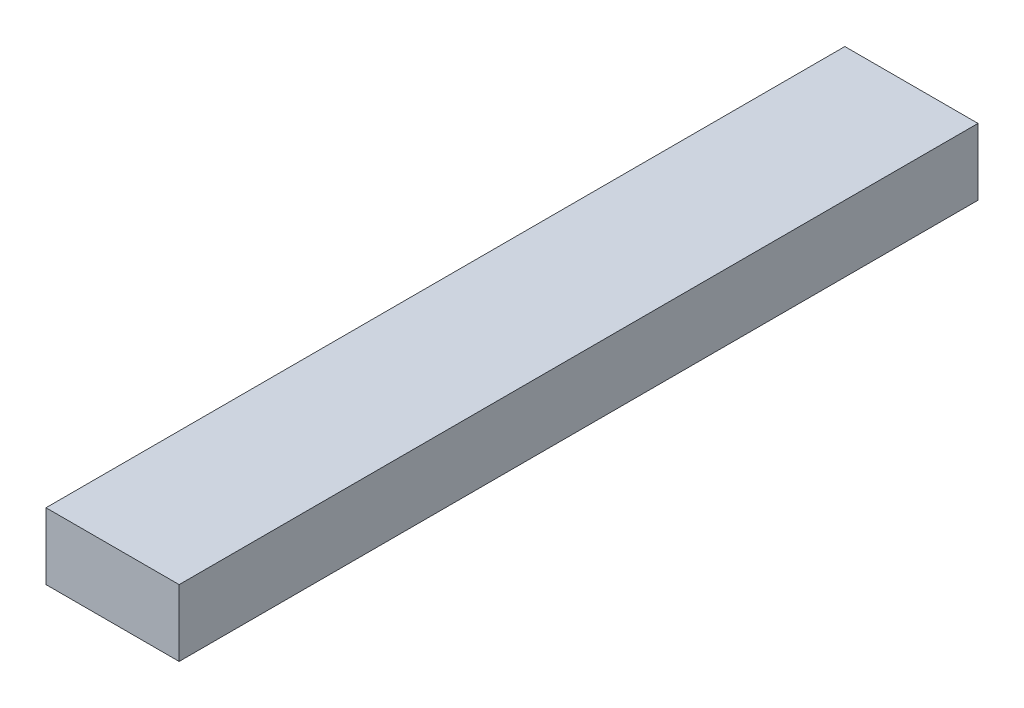
ISO-10303-21;
HEADER;
FILE_DESCRIPTION(('STEP AP214'),'2;1');
FILE_NAME('part.step','',(''),(''),'','','');
FILE_SCHEMA(('AUTOMOTIVE_DESIGN { 1 0 10303 214 1 1 1 1 }'));
ENDSEC;
DATA;
#1=APPLICATION_CONTEXT('core data for automotive mechanical design processes');
#2=APPLICATION_PROTOCOL_DEFINITION('international standard','automotive_design',2000,#1);
#3=PRODUCT_CONTEXT('',#1,'mechanical');
#4=PRODUCT('Part','Part','',(#3));
#5=PRODUCT_RELATED_PRODUCT_CATEGORY('part','',(#4));
#6=PRODUCT_DEFINITION_FORMATION('','',#4);
#7=PRODUCT_DEFINITION_CONTEXT('part definition',#1,'design');
#8=PRODUCT_DEFINITION('design','',#6,#7);
#9=PRODUCT_DEFINITION_SHAPE('','',#8);
#10=(LENGTH_UNIT() NAMED_UNIT(*) SI_UNIT(.MILLI.,.METRE.));
#11=(NAMED_UNIT(*) PLANE_ANGLE_UNIT() SI_UNIT($,.RADIAN.));
#12=(NAMED_UNIT(*) SI_UNIT($,.STERADIAN.) SOLID_ANGLE_UNIT());
#13=UNCERTAINTY_MEASURE_WITH_UNIT(LENGTH_MEASURE(1.E-05),#10,'distance_accuracy_value','');
#14=(GEOMETRIC_REPRESENTATION_CONTEXT(3) GLOBAL_UNCERTAINTY_ASSIGNED_CONTEXT((#13)) GLOBAL_UNIT_ASSIGNED_CONTEXT((#10,
#11,#12)) REPRESENTATION_CONTEXT('',''));
#15=CARTESIAN_POINT('',(0.,0.,0.));
#16=DIRECTION('',(0.,0.,1.));
#17=DIRECTION('',(1.,0.,0.));
#18=AXIS2_PLACEMENT_3D('',#15,#16,#17);
#19=CARTESIAN_POINT('',(0.,6.34999999999999,0.));
#20=DIRECTION('',(1.,0.,0.));
#21=DIRECTION('',(0.,0.,-1.));
#22=AXIS2_PLACEMENT_3D('',#19,#20,#21);
#23=PLANE('',#22);
#24=DIRECTION('',(0.,0.,1.));
#25=VECTOR('',#24,1.);
#26=CARTESIAN_POINT('',(0.,0.,0.));
#27=LINE('',#26,#25);
#28=CARTESIAN_POINT('',(0.,0.,-304.8));
#29=VERTEX_POINT('',#28);
#30=CARTESIAN_POINT('',(0.,0.,-228.6));
#31=VERTEX_POINT('',#30);
#32=EDGE_CURVE('E99',#29,#31,#27,.T.);
#33=ORIENTED_EDGE('',*,*,#32,.T.);
#34=DIRECTION('',(0.,1.,0.));
#35=VECTOR('',#34,1.);
#36=CARTESIAN_POINT('',(0.,0.,-228.6));
#37=LINE('',#36,#35);
#38=CARTESIAN_POINT('',(0.,6.34999999999999,-228.6));
#39=VERTEX_POINT('',#38);
#40=EDGE_CURVE('E48',#31,#39,#37,.T.);
#41=ORIENTED_EDGE('',*,*,#40,.T.);
#42=DIRECTION('',(0.,0.,1.));
#43=VECTOR('',#42,1.);
#44=CARTESIAN_POINT('',(0.,6.34999999999999,0.));
#45=LINE('',#44,#43);
#46=CARTESIAN_POINT('',(0.,6.34999999999999,-304.8));
#47=VERTEX_POINT('',#46);
#48=EDGE_CURVE('E101',#47,#39,#45,.T.);
#49=ORIENTED_EDGE('',*,*,#48,.F.);
#50=DIRECTION('',(0.,-1.,0.));
#51=VECTOR('',#50,1.);
#52=CARTESIAN_POINT('',(0.,6.34999999999999,-304.8));
#53=LINE('',#52,#51);
#54=EDGE_CURVE('E11',#47,#29,#53,.T.);
#55=ORIENTED_EDGE('',*,*,#54,.T.);
#56=EDGE_LOOP('',(#33,#41,#49,#55));
#57=FACE_BOUND('',#56,.T.);
#58=ADVANCED_FACE('F34',(#57),#23,.F.);
#59=CARTESIAN_POINT('',(0.,6.34999999999999,-304.8));
#60=DIRECTION('',(0.,0.,1.));
#61=DIRECTION('',(1.,0.,0.));
#62=AXIS2_PLACEMENT_3D('',#59,#60,#61);
#63=PLANE('',#62);
#64=DIRECTION('',(-1.,0.,0.));
#65=VECTOR('',#64,1.);
#66=CARTESIAN_POINT('',(0.,6.34999999999999,-304.8));
#67=LINE('',#66,#65);
#68=CARTESIAN_POINT('',(12.7,6.34999999999999,-304.8));
#69=VERTEX_POINT('',#68);
#70=EDGE_CURVE('E41',#69,#47,#67,.T.);
#71=ORIENTED_EDGE('',*,*,#70,.F.);
#72=DIRECTION('',(0.,1.,0.));
#73=VECTOR('',#72,1.);
#74=CARTESIAN_POINT('',(12.7,0.,-304.8));
#75=LINE('',#74,#73);
#76=CARTESIAN_POINT('',(12.7,0.,-304.8));
#77=VERTEX_POINT('',#76);
#78=EDGE_CURVE('E97',#77,#69,#75,.T.);
#79=ORIENTED_EDGE('',*,*,#78,.F.);
#80=DIRECTION('',(-1.,0.,0.));
#81=VECTOR('',#80,1.);
#82=CARTESIAN_POINT('',(0.,0.,-304.8));
#83=LINE('',#82,#81);
#84=EDGE_CURVE('E91',#77,#29,#83,.T.);
#85=ORIENTED_EDGE('',*,*,#84,.T.);
#86=ORIENTED_EDGE('',*,*,#54,.F.);
#87=EDGE_LOOP('',(#71,#79,#85,#86));
#88=FACE_BOUND('',#87,.T.);
#89=ADVANCED_FACE('F105',(#88),#63,.F.);
#90=CARTESIAN_POINT('',(0.,6.34999999999999,0.));
#91=DIRECTION('',(0.,-1.,0.));
#92=DIRECTION('',(0.,0.,-1.));
#93=AXIS2_PLACEMENT_3D('',#90,#91,#92);
#94=PLANE('',#93);
#95=DIRECTION('',(-1.,0.,0.));
#96=VECTOR('',#95,1.);
#97=CARTESIAN_POINT('',(12.7,6.34999999999999,-228.6));
#98=LINE('',#97,#96);
#99=CARTESIAN_POINT('',(12.7,6.34999999999999,-228.6));
#100=VERTEX_POINT('',#99);
#101=EDGE_CURVE('E92',#100,#39,#98,.T.);
#102=ORIENTED_EDGE('',*,*,#101,.F.);
#103=DIRECTION('',(0.,0.,1.));
#104=VECTOR('',#103,1.);
#105=CARTESIAN_POINT('',(12.7,6.34999999999999,-304.8));
#106=LINE('',#105,#104);
#107=EDGE_CURVE('E80',#69,#100,#106,.T.);
#108=ORIENTED_EDGE('',*,*,#107,.F.);
#109=ORIENTED_EDGE('',*,*,#70,.T.);
#110=ORIENTED_EDGE('',*,*,#48,.T.);
#111=EDGE_LOOP('',(#102,#108,#109,#110));
#112=FACE_BOUND('',#111,.T.);
#113=ADVANCED_FACE('F108',(#112),#94,.F.);
#114=CARTESIAN_POINT('',(0.,0.,0.));
#115=DIRECTION('',(0.,-1.,0.));
#116=DIRECTION('',(0.,0.,-1.));
#117=AXIS2_PLACEMENT_3D('',#114,#115,#116);
#118=PLANE('',#117);
#119=DIRECTION('',(0.,0.,1.));
#120=VECTOR('',#119,1.);
#121=CARTESIAN_POINT('',(12.7,0.,-304.8));
#122=LINE('',#121,#120);
#123=CARTESIAN_POINT('',(12.7,0.,-228.6));
#124=VERTEX_POINT('',#123);
#125=EDGE_CURVE('E78',#77,#124,#122,.T.);
#126=ORIENTED_EDGE('',*,*,#125,.T.);
#127=DIRECTION('',(-1.,0.,0.));
#128=VECTOR('',#127,1.);
#129=CARTESIAN_POINT('',(12.7,0.,-228.6));
#130=LINE('',#129,#128);
#131=EDGE_CURVE('E82',#124,#31,#130,.T.);
#132=ORIENTED_EDGE('',*,*,#131,.T.);
#133=ORIENTED_EDGE('',*,*,#32,.F.);
#134=ORIENTED_EDGE('',*,*,#84,.F.);
#135=EDGE_LOOP('',(#126,#132,#133,#134));
#136=FACE_BOUND('',#135,.T.);
#137=ADVANCED_FACE('F90',(#136),#118,.T.);
#138=CARTESIAN_POINT('',(12.7,0.,-304.8));
#139=DIRECTION('',(-1.,0.,0.));
#140=DIRECTION('',(0.,0.,1.));
#141=AXIS2_PLACEMENT_3D('',#138,#139,#140);
#142=PLANE('',#141);
#143=ORIENTED_EDGE('',*,*,#107,.T.);
#144=DIRECTION('',(0.,1.,0.));
#145=VECTOR('',#144,1.);
#146=CARTESIAN_POINT('',(12.7,0.,-228.6));
#147=LINE('',#146,#145);
#148=EDGE_CURVE('E75',#124,#100,#147,.T.);
#149=ORIENTED_EDGE('',*,*,#148,.F.);
#150=ORIENTED_EDGE('',*,*,#125,.F.);
#151=ORIENTED_EDGE('',*,*,#78,.T.);
#152=EDGE_LOOP('',(#143,#149,#150,#151));
#153=FACE_BOUND('',#152,.T.);
#154=ADVANCED_FACE('F76',(#153),#142,.F.);
#155=CARTESIAN_POINT('',(12.7,0.,-228.6));
#156=DIRECTION('',(0.,0.,-1.));
#157=DIRECTION('',(-1.,0.,0.));
#158=AXIS2_PLACEMENT_3D('',#155,#156,#157);
#159=PLANE('',#158);
#160=ORIENTED_EDGE('',*,*,#101,.T.);
#161=ORIENTED_EDGE('',*,*,#40,.F.);
#162=ORIENTED_EDGE('',*,*,#131,.F.);
#163=ORIENTED_EDGE('',*,*,#148,.T.);
#164=EDGE_LOOP('',(#160,#161,#162,#163));
#165=FACE_BOUND('',#164,.T.);
#166=ADVANCED_FACE('F84',(#165),#159,.F.);
#167=CLOSED_SHELL('',(#58,#89,#113,#137,#154,#166));
#168=MANIFOLD_SOLID_BREP('B2',#167);
#169=ADVANCED_BREP_SHAPE_REPRESENTATION('',(#18,#168),#14);
#170=SHAPE_DEFINITION_REPRESENTATION(#9,#169);
ENDSEC;
END-ISO-10303-21;
